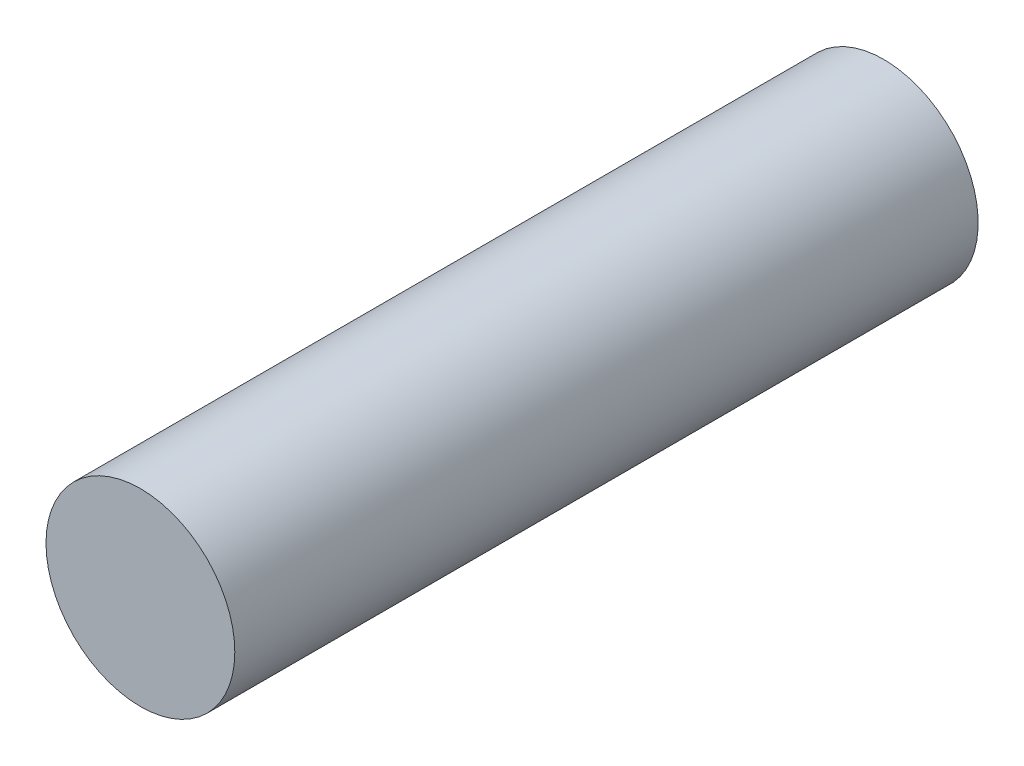
ISO-10303-21;
HEADER;
FILE_DESCRIPTION(('STEP AP214'),'2;1');
FILE_NAME('part.step','',(''),(''),'','','');
FILE_SCHEMA(('AUTOMOTIVE_DESIGN { 1 0 10303 214 1 1 1 1 }'));
ENDSEC;
DATA;
#1=APPLICATION_CONTEXT('core data for automotive mechanical design processes');
#2=APPLICATION_PROTOCOL_DEFINITION('international standard','automotive_design',2000,#1);
#3=PRODUCT_CONTEXT('',#1,'mechanical');
#4=PRODUCT('Part','Part','',(#3));
#5=PRODUCT_RELATED_PRODUCT_CATEGORY('part','',(#4));
#6=PRODUCT_DEFINITION_FORMATION('','',#4);
#7=PRODUCT_DEFINITION_CONTEXT('part definition',#1,'design');
#8=PRODUCT_DEFINITION('design','',#6,#7);
#9=PRODUCT_DEFINITION_SHAPE('','',#8);
#10=(LENGTH_UNIT() NAMED_UNIT(*) SI_UNIT(.MILLI.,.METRE.));
#11=(NAMED_UNIT(*) PLANE_ANGLE_UNIT() SI_UNIT($,.RADIAN.));
#12=(NAMED_UNIT(*) SI_UNIT($,.STERADIAN.) SOLID_ANGLE_UNIT());
#13=UNCERTAINTY_MEASURE_WITH_UNIT(LENGTH_MEASURE(1.E-05),#10,'distance_accuracy_value','');
#14=(GEOMETRIC_REPRESENTATION_CONTEXT(3) GLOBAL_UNCERTAINTY_ASSIGNED_CONTEXT((#13)) GLOBAL_UNIT_ASSIGNED_CONTEXT((#10,
#11,#12)) REPRESENTATION_CONTEXT('',''));
#15=CARTESIAN_POINT('',(0.,0.,0.));
#16=DIRECTION('',(0.,0.,1.));
#17=DIRECTION('',(1.,0.,0.));
#18=AXIS2_PLACEMENT_3D('',#15,#16,#17);
#19=CARTESIAN_POINT('',(0.,0.,75.));
#20=DIRECTION('',(0.,0.,-1.));
#21=DIRECTION('',(-1.,0.,0.));
#22=AXIS2_PLACEMENT_3D('',#19,#20,#21);
#23=CYLINDRICAL_SURFACE('',#22,12.7);
#24=CARTESIAN_POINT('',(0.,0.,75.));
#25=DIRECTION('',(0.,0.,1.));
#26=DIRECTION('',(1.,0.,0.));
#27=AXIS2_PLACEMENT_3D('',#24,#25,#26);
#28=CIRCLE('',#27,12.7);
#29=CARTESIAN_POINT('',(12.7,0.,75.));
#30=VERTEX_POINT('',#29);
#31=EDGE_CURVE('E10',#30,#30,#28,.T.);
#32=ORIENTED_EDGE('',*,*,#31,.F.);
#33=EDGE_LOOP('',(#32));
#34=FACE_BOUND('',#33,.T.);
#35=CARTESIAN_POINT('',(0.,0.,-25.));
#36=DIRECTION('',(0.,0.,-1.));
#37=DIRECTION('',(-1.,0.,0.));
#38=AXIS2_PLACEMENT_3D('',#35,#36,#37);
#39=CIRCLE('',#38,12.7);
#40=CARTESIAN_POINT('',(-12.7,0.,-25.));
#41=VERTEX_POINT('',#40);
#42=EDGE_CURVE('E48',#41,#41,#39,.T.);
#43=ORIENTED_EDGE('',*,*,#42,.F.);
#44=EDGE_LOOP('',(#43));
#45=FACE_BOUND('',#44,.T.);
#46=ADVANCED_FACE('F41',(#34,#45),#23,.T.);
#47=CARTESIAN_POINT('',(0.,0.,75.));
#48=DIRECTION('',(0.,0.,1.));
#49=DIRECTION('',(1.,0.,0.));
#50=AXIS2_PLACEMENT_3D('',#47,#48,#49);
#51=PLANE('',#50);
#52=ORIENTED_EDGE('',*,*,#31,.T.);
#53=EDGE_LOOP('',(#52));
#54=FACE_BOUND('',#53,.T.);
#55=ADVANCED_FACE('F76',(#54),#51,.T.);
#56=CARTESIAN_POINT('',(0.,0.,-25.));
#57=DIRECTION('',(0.,0.,-1.));
#58=DIRECTION('',(-1.,0.,0.));
#59=AXIS2_PLACEMENT_3D('',#56,#57,#58);
#60=PLANE('',#59);
#61=ORIENTED_EDGE('',*,*,#42,.T.);
#62=EDGE_LOOP('',(#61));
#63=FACE_BOUND('',#62,.T.);
#64=CARTESIAN_POINT('',(0.,0.,-25.));
#65=DIRECTION('',(0.,0.,-1.));
#66=DIRECTION('',(-1.,0.,0.));
#67=AXIS2_PLACEMENT_3D('',#64,#65,#66);
#68=CIRCLE('',#67,9.);
#69=CARTESIAN_POINT('',(-9.,0.,-25.));
#70=VERTEX_POINT('',#69);
#71=EDGE_CURVE('E53',#70,#70,#68,.T.);
#72=ORIENTED_EDGE('',*,*,#71,.F.);
#73=EDGE_LOOP('',(#72));
#74=FACE_BOUND('',#73,.T.);
#75=ADVANCED_FACE('F69',(#63,#74),#60,.T.);
#76=CARTESIAN_POINT('',(0.,0.,-25.));
#77=DIRECTION('',(0.,0.,1.));
#78=DIRECTION('',(1.,0.,0.));
#79=AXIS2_PLACEMENT_3D('',#76,#77,#78);
#80=CYLINDRICAL_SURFACE('',#79,9.);
#81=ORIENTED_EDGE('',*,*,#71,.T.);
#82=EDGE_LOOP('',(#81));
#83=FACE_BOUND('',#82,.T.);
#84=CARTESIAN_POINT('',(0.,0.,0.));
#85=DIRECTION('',(0.,0.,-1.));
#86=DIRECTION('',(-1.,0.,0.));
#87=AXIS2_PLACEMENT_3D('',#84,#85,#86);
#88=CIRCLE('',#87,9.);
#89=CARTESIAN_POINT('',(-9.,0.,0.));
#90=VERTEX_POINT('',#89);
#91=EDGE_CURVE('E58',#90,#90,#88,.T.);
#92=ORIENTED_EDGE('',*,*,#91,.F.);
#93=EDGE_LOOP('',(#92));
#94=FACE_BOUND('',#93,.T.);
#95=ADVANCED_FACE('F67',(#83,#94),#80,.F.);
#96=CARTESIAN_POINT('',(0.,0.,0.));
#97=DIRECTION('',(0.,0.,1.));
#98=DIRECTION('',(1.,0.,0.));
#99=AXIS2_PLACEMENT_3D('',#96,#97,#98);
#100=PLANE('',#99);
#101=ORIENTED_EDGE('',*,*,#91,.T.);
#102=EDGE_LOOP('',(#101));
#103=FACE_BOUND('',#102,.T.);
#104=ADVANCED_FACE('F65',(#103),#100,.F.);
#105=CLOSED_SHELL('',(#46,#55,#75,#95,#104));
#106=MANIFOLD_SOLID_BREP('B2',#105);
#107=ADVANCED_BREP_SHAPE_REPRESENTATION('',(#18,#106),#14);
#108=SHAPE_DEFINITION_REPRESENTATION(#9,#107);
ENDSEC;
END-ISO-10303-21;
